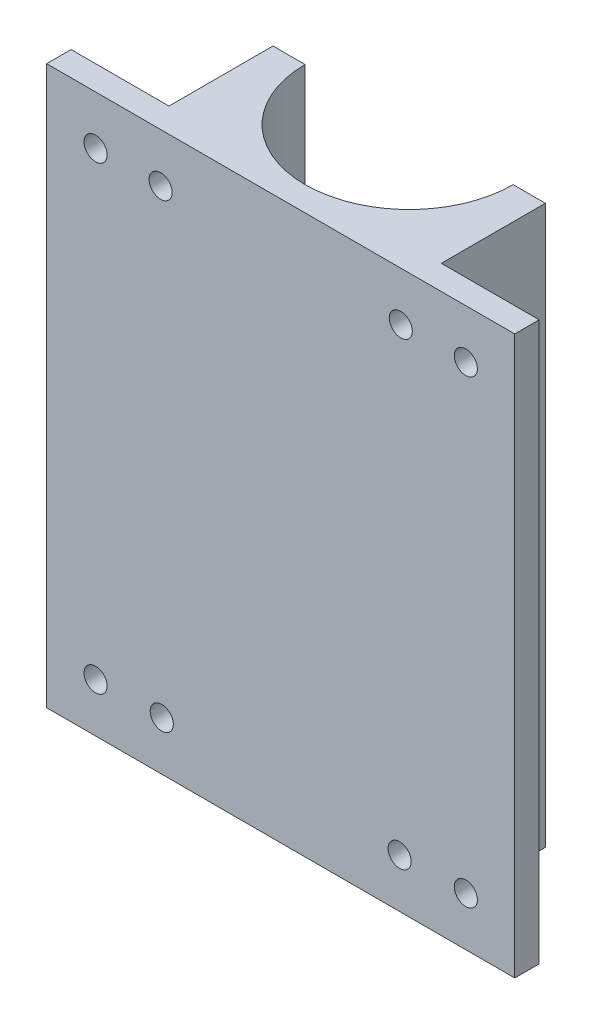
ISO-10303-21;
HEADER;
FILE_DESCRIPTION(('STEP AP214'),'2;1');
FILE_NAME('part.step','',(''),(''),'','','');
FILE_SCHEMA(('AUTOMOTIVE_DESIGN { 1 0 10303 214 1 1 1 1 }'));
ENDSEC;
DATA;
#1=APPLICATION_CONTEXT('core data for automotive mechanical design processes');
#2=APPLICATION_PROTOCOL_DEFINITION('international standard','automotive_design',2000,#1);
#3=PRODUCT_CONTEXT('',#1,'mechanical');
#4=PRODUCT('Part','Part','',(#3));
#5=PRODUCT_RELATED_PRODUCT_CATEGORY('part','',(#4));
#6=PRODUCT_DEFINITION_FORMATION('','',#4);
#7=PRODUCT_DEFINITION_CONTEXT('part definition',#1,'design');
#8=PRODUCT_DEFINITION('design','',#6,#7);
#9=PRODUCT_DEFINITION_SHAPE('','',#8);
#10=(LENGTH_UNIT() NAMED_UNIT(*) SI_UNIT(.MILLI.,.METRE.));
#11=(NAMED_UNIT(*) PLANE_ANGLE_UNIT() SI_UNIT($,.RADIAN.));
#12=(NAMED_UNIT(*) SI_UNIT($,.STERADIAN.) SOLID_ANGLE_UNIT());
#13=UNCERTAINTY_MEASURE_WITH_UNIT(LENGTH_MEASURE(1.E-05),#10,'distance_accuracy_value','');
#14=(GEOMETRIC_REPRESENTATION_CONTEXT(3) GLOBAL_UNCERTAINTY_ASSIGNED_CONTEXT((#13)) GLOBAL_UNIT_ASSIGNED_CONTEXT((#10,
#11,#12)) REPRESENTATION_CONTEXT('',''));
#15=CARTESIAN_POINT('',(0.,0.,0.));
#16=DIRECTION('',(0.,0.,1.));
#17=DIRECTION('',(1.,0.,0.));
#18=AXIS2_PLACEMENT_3D('',#15,#16,#17);
#19=CARTESIAN_POINT('',(6.525,72.39,-31.19817027));
#20=DIRECTION('',(0.,-1.,0.));
#21=DIRECTION('',(0.,0.,-1.));
#22=AXIS2_PLACEMENT_3D('',#19,#20,#21);
#23=CYLINDRICAL_SURFACE('',#22,13.5);
#24=CARTESIAN_POINT('',(6.525,51.39,-31.19817027));
#25=DIRECTION('',(0.,1.,0.));
#26=DIRECTION('',(0.,0.,1.));
#27=AXIS2_PLACEMENT_3D('',#24,#25,#26);
#28=CIRCLE('',#27,13.5);
#29=CARTESIAN_POINT('',(-6.975,51.39,-31.1981702709716));
#30=VERTEX_POINT('',#29);
#31=CARTESIAN_POINT('',(20.025,51.39,-31.1981702709716));
#32=VERTEX_POINT('',#31);
#33=EDGE_CURVE('E286',#30,#32,#28,.T.);
#34=ORIENTED_EDGE('',*,*,#33,.F.);
#35=DIRECTION('',(0.,-1.,0.));
#36=VECTOR('',#35,1.);
#37=CARTESIAN_POINT('',(-6.975,72.39,-31.1981702709716));
#38=LINE('',#37,#36);
#39=CARTESIAN_POINT('',(-6.975,72.39,-31.1981702709716));
#40=VERTEX_POINT('',#39);
#41=EDGE_CURVE('E11',#40,#30,#38,.T.);
#42=ORIENTED_EDGE('',*,*,#41,.F.);
#43=CARTESIAN_POINT('',(6.525,72.39,-31.19817027));
#44=DIRECTION('',(0.,1.,0.));
#45=DIRECTION('',(0.,0.,1.));
#46=AXIS2_PLACEMENT_3D('',#43,#44,#45);
#47=CIRCLE('',#46,13.5);
#48=CARTESIAN_POINT('',(20.025,72.39,-31.1981702709716));
#49=VERTEX_POINT('',#48);
#50=EDGE_CURVE('E173',#40,#49,#47,.T.);
#51=ORIENTED_EDGE('',*,*,#50,.T.);
#52=DIRECTION('',(0.,-1.,0.));
#53=VECTOR('',#52,1.);
#54=CARTESIAN_POINT('',(20.025,72.39,-31.1981702709716));
#55=LINE('',#54,#53);
#56=EDGE_CURVE('E138',#49,#32,#55,.T.);
#57=ORIENTED_EDGE('',*,*,#56,.T.);
#58=EDGE_LOOP('',(#34,#42,#51,#57));
#59=FACE_BOUND('',#58,.T.);
#60=ADVANCED_FACE('F33',(#59),#23,.F.);
#61=CARTESIAN_POINT('',(0.,72.39,-31.1981702709716));
#62=DIRECTION('',(0.,0.,1.));
#63=DIRECTION('',(1.,0.,0.));
#64=AXIS2_PLACEMENT_3D('',#61,#62,#63);
#65=PLANE('',#64);
#66=CARTESIAN_POINT('',(-9.0566884,66.04,-31.1981702709716));
#67=DIRECTION('',(0.,0.,-1.));
#68=DIRECTION('',(-1.,0.,0.));
#69=AXIS2_PLACEMENT_3D('',#66,#67,#68);
#70=CIRCLE('',#69,1.49999999999999);
#71=CARTESIAN_POINT('',(-10.5566884,66.04,-31.1981702709716));
#72=VERTEX_POINT('',#71);
#73=EDGE_CURVE('E233',#72,#72,#70,.T.);
#74=ORIENTED_EDGE('',*,*,#73,.F.);
#75=EDGE_LOOP('',(#74));
#76=FACE_BOUND('',#75,.T.);
#77=CARTESIAN_POINT('',(-8.9066884,6.35,-31.1981702709716));
#78=DIRECTION('',(0.,0.,-1.));
#79=DIRECTION('',(-1.,0.,0.));
#80=AXIS2_PLACEMENT_3D('',#77,#78,#79);
#81=CIRCLE('',#80,1.49999999999999);
#82=CARTESIAN_POINT('',(-10.4066884,6.35,-31.1981702709716));
#83=VERTEX_POINT('',#82);
#84=EDGE_CURVE('E237',#83,#83,#81,.T.);
#85=ORIENTED_EDGE('',*,*,#84,.F.);
#86=EDGE_LOOP('',(#85));
#87=FACE_BOUND('',#86,.T.);
#88=DIRECTION('',(-1.,0.,0.));
#89=VECTOR('',#88,1.);
#90=CARTESIAN_POINT('',(0.,0.,-31.1981702709716));
#91=LINE('',#90,#89);
#92=CARTESIAN_POINT('',(-6.675,0.,-31.1981702709716));
#93=VERTEX_POINT('',#92);
#94=CARTESIAN_POINT('',(-11.1466884,0.,-31.1981702709716));
#95=VERTEX_POINT('',#94);
#96=EDGE_CURVE('E145',#93,#95,#91,.T.);
#97=ORIENTED_EDGE('',*,*,#96,.T.);
#98=DIRECTION('',(0.,-1.,0.));
#99=VECTOR('',#98,1.);
#100=CARTESIAN_POINT('',(-11.1466884,72.39,-31.1981702709716));
#101=LINE('',#100,#99);
#102=CARTESIAN_POINT('',(-11.1466884,72.39,-31.1981702709716));
#103=VERTEX_POINT('',#102);
#104=EDGE_CURVE('E44',#103,#95,#101,.T.);
#105=ORIENTED_EDGE('',*,*,#104,.F.);
#106=DIRECTION('',(-1.,0.,0.));
#107=VECTOR('',#106,1.);
#108=CARTESIAN_POINT('',(0.,72.39,-31.1981702709716));
#109=LINE('',#108,#107);
#110=EDGE_CURVE('E265',#40,#103,#109,.T.);
#111=ORIENTED_EDGE('',*,*,#110,.F.);
#112=ORIENTED_EDGE('',*,*,#41,.T.);
#113=DIRECTION('',(1.,0.,0.));
#114=VECTOR('',#113,1.);
#115=CARTESIAN_POINT('',(-6.975,51.39,-31.1981702709716));
#116=LINE('',#115,#114);
#117=CARTESIAN_POINT('',(-6.675,51.39,-31.1981702709716));
#118=VERTEX_POINT('',#117);
#119=EDGE_CURVE('E294',#30,#118,#116,.T.);
#120=ORIENTED_EDGE('',*,*,#119,.T.);
#121=DIRECTION('',(0.,-1.,0.));
#122=VECTOR('',#121,1.);
#123=CARTESIAN_POINT('',(-6.675,51.39,-31.1981702709716));
#124=LINE('',#123,#122);
#125=EDGE_CURVE('E245',#118,#93,#124,.T.);
#126=ORIENTED_EDGE('',*,*,#125,.T.);
#127=EDGE_LOOP('',(#97,#105,#111,#112,#120,#126));
#128=FACE_BOUND('',#127,.T.);
#129=ADVANCED_FACE('F223',(#76,#87,#128),#65,.F.);
#130=CARTESIAN_POINT('',(-11.1466884,72.39,0.));
#131=DIRECTION('',(1.,0.,0.));
#132=DIRECTION('',(0.,0.,-1.));
#133=AXIS2_PLACEMENT_3D('',#130,#131,#132);
#134=PLANE('',#133);
#135=DIRECTION('',(0.,0.,1.));
#136=VECTOR('',#135,1.);
#137=CARTESIAN_POINT('',(-11.1466884,0.,0.));
#138=LINE('',#137,#136);
#139=CARTESIAN_POINT('',(-11.1466884,0.,-17.6981702709716));
#140=VERTEX_POINT('',#139);
#141=EDGE_CURVE('E147',#95,#140,#138,.T.);
#142=ORIENTED_EDGE('',*,*,#141,.T.);
#143=DIRECTION('',(0.,-1.,0.));
#144=VECTOR('',#143,1.);
#145=CARTESIAN_POINT('',(-11.1466884,72.39,-17.6981702709716));
#146=LINE('',#145,#144);
#147=CARTESIAN_POINT('',(-11.1466884,72.39,-17.6981702709716));
#148=VERTEX_POINT('',#147);
#149=EDGE_CURVE('E185',#148,#140,#146,.T.);
#150=ORIENTED_EDGE('',*,*,#149,.F.);
#151=DIRECTION('',(0.,0.,1.));
#152=VECTOR('',#151,1.);
#153=CARTESIAN_POINT('',(-11.1466884,72.39,0.));
#154=LINE('',#153,#152);
#155=EDGE_CURVE('E251',#103,#148,#154,.T.);
#156=ORIENTED_EDGE('',*,*,#155,.F.);
#157=ORIENTED_EDGE('',*,*,#104,.T.);
#158=EDGE_LOOP('',(#142,#150,#156,#157));
#159=FACE_BOUND('',#158,.T.);
#160=ADVANCED_FACE('F220',(#159),#134,.F.);
#161=CARTESIAN_POINT('',(0.,72.39,-17.6981702709716));
#162=DIRECTION('',(0.,0.,-1.));
#163=DIRECTION('',(-1.,0.,0.));
#164=AXIS2_PLACEMENT_3D('',#161,#162,#163);
#165=PLANE('',#164);
#166=CARTESIAN_POINT('',(-17.4985284,6.35,-17.6981702709716));
#167=DIRECTION('',(0.,0.,-1.));
#168=DIRECTION('',(-1.,0.,0.));
#169=AXIS2_PLACEMENT_3D('',#166,#167,#168);
#170=CIRCLE('',#169,1.49999999999999);
#171=CARTESIAN_POINT('',(-18.9985284,6.35,-17.6981702709716));
#172=VERTEX_POINT('',#171);
#173=EDGE_CURVE('E330',#172,#172,#170,.T.);
#174=ORIENTED_EDGE('',*,*,#173,.F.);
#175=EDGE_LOOP('',(#174));
#176=FACE_BOUND('',#175,.T.);
#177=CARTESIAN_POINT('',(-17.4985284,66.04,-17.6981702709716));
#178=DIRECTION('',(0.,0.,-1.));
#179=DIRECTION('',(-1.,0.,0.));
#180=AXIS2_PLACEMENT_3D('',#177,#178,#179);
#181=CIRCLE('',#180,1.49999999999999);
#182=CARTESIAN_POINT('',(-18.9985284,66.04,-17.6981702709716));
#183=VERTEX_POINT('',#182);
#184=EDGE_CURVE('E324',#183,#183,#181,.T.);
#185=ORIENTED_EDGE('',*,*,#184,.F.);
#186=EDGE_LOOP('',(#185));
#187=FACE_BOUND('',#186,.T.);
#188=DIRECTION('',(1.,0.,0.));
#189=VECTOR('',#188,1.);
#190=CARTESIAN_POINT('',(0.,0.,-17.6981702709716));
#191=LINE('',#190,#189);
#192=CARTESIAN_POINT('',(-23.8485284,0.,-17.6981702709716));
#193=VERTEX_POINT('',#192);
#194=EDGE_CURVE('E151',#193,#140,#191,.T.);
#195=ORIENTED_EDGE('',*,*,#194,.F.);
#196=DIRECTION('',(0.,-1.,0.));
#197=VECTOR('',#196,1.);
#198=CARTESIAN_POINT('',(-23.8485284,72.39,-17.6981702709716));
#199=LINE('',#198,#197);
#200=CARTESIAN_POINT('',(-23.8485284,72.39,-17.6981702709716));
#201=VERTEX_POINT('',#200);
#202=EDGE_CURVE('E183',#201,#193,#199,.T.);
#203=ORIENTED_EDGE('',*,*,#202,.F.);
#204=DIRECTION('',(1.,0.,0.));
#205=VECTOR('',#204,1.);
#206=CARTESIAN_POINT('',(0.,72.39,-17.6981702709716));
#207=LINE('',#206,#205);
#208=EDGE_CURVE('E260',#201,#148,#207,.T.);
#209=ORIENTED_EDGE('',*,*,#208,.T.);
#210=ORIENTED_EDGE('',*,*,#149,.T.);
#211=EDGE_LOOP('',(#195,#203,#209,#210));
#212=FACE_BOUND('',#211,.T.);
#213=ADVANCED_FACE('F216',(#176,#187,#212),#165,.T.);
#214=CARTESIAN_POINT('',(-23.8485284,72.39,0.));
#215=DIRECTION('',(1.,0.,0.));
#216=DIRECTION('',(0.,0.,-1.));
#217=AXIS2_PLACEMENT_3D('',#214,#215,#216);
#218=PLANE('',#217);
#219=DIRECTION('',(0.,0.,1.));
#220=VECTOR('',#219,1.);
#221=CARTESIAN_POINT('',(-23.8485284,0.,0.));
#222=LINE('',#221,#220);
#223=CARTESIAN_POINT('',(-23.8485284,0.,-14.5231702709716));
#224=VERTEX_POINT('',#223);
#225=EDGE_CURVE('E154',#193,#224,#222,.T.);
#226=ORIENTED_EDGE('',*,*,#225,.T.);
#227=DIRECTION('',(0.,-1.,0.));
#228=VECTOR('',#227,1.);
#229=CARTESIAN_POINT('',(-23.8485284,72.39,-14.5231702709716));
#230=LINE('',#229,#228);
#231=CARTESIAN_POINT('',(-23.8485284,72.39,-14.5231702709716));
#232=VERTEX_POINT('',#231);
#233=EDGE_CURVE('E180',#232,#224,#230,.T.);
#234=ORIENTED_EDGE('',*,*,#233,.F.);
#235=DIRECTION('',(0.,0.,1.));
#236=VECTOR('',#235,1.);
#237=CARTESIAN_POINT('',(-23.8485284,72.39,0.));
#238=LINE('',#237,#236);
#239=EDGE_CURVE('E261',#201,#232,#238,.T.);
#240=ORIENTED_EDGE('',*,*,#239,.F.);
#241=ORIENTED_EDGE('',*,*,#202,.T.);
#242=EDGE_LOOP('',(#226,#234,#240,#241));
#243=FACE_BOUND('',#242,.T.);
#244=ADVANCED_FACE('F212',(#243),#218,.F.);
#245=CARTESIAN_POINT('',(0.,72.39,-14.5231702709716));
#246=DIRECTION('',(0.,0.,-1.));
#247=DIRECTION('',(-1.,0.,0.));
#248=AXIS2_PLACEMENT_3D('',#245,#246,#247);
#249=PLANE('',#248);
#250=CARTESIAN_POINT('',(22.1133116,66.04,-14.5231702709716));
#251=DIRECTION('',(0.,0.,-1.));
#252=DIRECTION('',(-1.,0.,0.));
#253=AXIS2_PLACEMENT_3D('',#250,#251,#252);
#254=CIRCLE('',#253,1.5);
#255=CARTESIAN_POINT('',(20.6133116,66.04,-14.5231702709716));
#256=VERTEX_POINT('',#255);
#257=EDGE_CURVE('E347',#256,#256,#254,.T.);
#258=ORIENTED_EDGE('',*,*,#257,.T.);
#259=EDGE_LOOP('',(#258));
#260=FACE_BOUND('',#259,.T.);
#261=CARTESIAN_POINT('',(-9.0566884,66.04,-14.5231702709716));
#262=DIRECTION('',(0.,0.,-1.));
#263=DIRECTION('',(-1.,0.,0.));
#264=AXIS2_PLACEMENT_3D('',#261,#262,#263);
#265=CIRCLE('',#264,1.5);
#266=CARTESIAN_POINT('',(-10.5566884,66.04,-14.5231702709716));
#267=VERTEX_POINT('',#266);
#268=EDGE_CURVE('E343',#267,#267,#265,.T.);
#269=ORIENTED_EDGE('',*,*,#268,.T.);
#270=EDGE_LOOP('',(#269));
#271=FACE_BOUND('',#270,.T.);
#272=CARTESIAN_POINT('',(-8.9066884,6.35,-14.5231702709716));
#273=DIRECTION('',(0.,0.,-1.));
#274=DIRECTION('',(-1.,0.,0.));
#275=AXIS2_PLACEMENT_3D('',#272,#273,#274);
#276=CIRCLE('',#275,1.5);
#277=CARTESIAN_POINT('',(-10.4066884,6.35,-14.5231702709716));
#278=VERTEX_POINT('',#277);
#279=EDGE_CURVE('E339',#278,#278,#276,.T.);
#280=ORIENTED_EDGE('',*,*,#279,.T.);
#281=EDGE_LOOP('',(#280));
#282=FACE_BOUND('',#281,.T.);
#283=CARTESIAN_POINT('',(21.9633116,6.35,-14.5231702709716));
#284=DIRECTION('',(0.,0.,-1.));
#285=DIRECTION('',(-1.,0.,0.));
#286=AXIS2_PLACEMENT_3D('',#283,#284,#285);
#287=CIRCLE('',#286,1.5);
#288=CARTESIAN_POINT('',(20.4633116,6.35,-14.5231702709716));
#289=VERTEX_POINT('',#288);
#290=EDGE_CURVE('E333',#289,#289,#287,.T.);
#291=ORIENTED_EDGE('',*,*,#290,.T.);
#292=EDGE_LOOP('',(#291));
#293=FACE_BOUND('',#292,.T.);
#294=CARTESIAN_POINT('',(-17.4985284,6.35,-14.5231702709716));
#295=DIRECTION('',(0.,0.,-1.));
#296=DIRECTION('',(-1.,0.,0.));
#297=AXIS2_PLACEMENT_3D('',#294,#295,#296);
#298=CIRCLE('',#297,1.5);
#299=CARTESIAN_POINT('',(-18.9985284,6.35,-14.5231702709716));
#300=VERTEX_POINT('',#299);
#301=EDGE_CURVE('E327',#300,#300,#298,.T.);
#302=ORIENTED_EDGE('',*,*,#301,.T.);
#303=EDGE_LOOP('',(#302));
#304=FACE_BOUND('',#303,.T.);
#305=CARTESIAN_POINT('',(-17.4985284,66.04,-14.5231702709716));
#306=DIRECTION('',(0.,0.,-1.));
#307=DIRECTION('',(-1.,0.,0.));
#308=AXIS2_PLACEMENT_3D('',#305,#306,#307);
#309=CIRCLE('',#308,1.5);
#310=CARTESIAN_POINT('',(-18.9985284,66.04,-14.5231702709716));
#311=VERTEX_POINT('',#310);
#312=EDGE_CURVE('E321',#311,#311,#309,.T.);
#313=ORIENTED_EDGE('',*,*,#312,.T.);
#314=EDGE_LOOP('',(#313));
#315=FACE_BOUND('',#314,.T.);
#316=CARTESIAN_POINT('',(30.5533116,66.04,-14.5231702709716));
#317=DIRECTION('',(0.,0.,-1.));
#318=DIRECTION('',(-1.,0.,0.));
#319=AXIS2_PLACEMENT_3D('',#316,#317,#318);
#320=CIRCLE('',#319,1.5);
#321=CARTESIAN_POINT('',(29.0533116,66.04,-14.5231702709716));
#322=VERTEX_POINT('',#321);
#323=EDGE_CURVE('E315',#322,#322,#320,.T.);
#324=ORIENTED_EDGE('',*,*,#323,.T.);
#325=EDGE_LOOP('',(#324));
#326=FACE_BOUND('',#325,.T.);
#327=CARTESIAN_POINT('',(30.5533116,6.35,-14.5231702709716));
#328=DIRECTION('',(0.,0.,-1.));
#329=DIRECTION('',(-1.,0.,0.));
#330=AXIS2_PLACEMENT_3D('',#327,#328,#329);
#331=CIRCLE('',#330,1.5);
#332=CARTESIAN_POINT('',(29.0533116,6.35,-14.5231702709716));
#333=VERTEX_POINT('',#332);
#334=EDGE_CURVE('E309',#333,#333,#331,.T.);
#335=ORIENTED_EDGE('',*,*,#334,.T.);
#336=EDGE_LOOP('',(#335));
#337=FACE_BOUND('',#336,.T.);
#338=DIRECTION('',(1.,0.,0.));
#339=VECTOR('',#338,1.);
#340=CARTESIAN_POINT('',(0.,0.,-14.5231702709716));
#341=LINE('',#340,#339);
#342=CARTESIAN_POINT('',(36.9033116,0.,-14.5231702709716));
#343=VERTEX_POINT('',#342);
#344=EDGE_CURVE('E156',#224,#343,#341,.T.);
#345=ORIENTED_EDGE('',*,*,#344,.T.);
#346=DIRECTION('',(0.,-1.,0.));
#347=VECTOR('',#346,1.);
#348=CARTESIAN_POINT('',(36.9033116,72.39,-14.5231702709716));
#349=LINE('',#348,#347);
#350=CARTESIAN_POINT('',(36.9033116,72.39,-14.5231702709716));
#351=VERTEX_POINT('',#350);
#352=EDGE_CURVE('E178',#351,#343,#349,.T.);
#353=ORIENTED_EDGE('',*,*,#352,.F.);
#354=DIRECTION('',(1.,0.,0.));
#355=VECTOR('',#354,1.);
#356=CARTESIAN_POINT('',(0.,72.39,-14.5231702709716));
#357=LINE('',#356,#355);
#358=EDGE_CURVE('E263',#232,#351,#357,.T.);
#359=ORIENTED_EDGE('',*,*,#358,.F.);
#360=ORIENTED_EDGE('',*,*,#233,.T.);
#361=EDGE_LOOP('',(#345,#353,#359,#360));
#362=FACE_BOUND('',#361,.T.);
#363=ADVANCED_FACE('F208',(#260,#271,#282,#293,#304,#315,#326,#337,#362),#249,.F.);
#364=CARTESIAN_POINT('',(36.9033116,72.39,0.));
#365=DIRECTION('',(1.,0.,0.));
#366=DIRECTION('',(0.,0.,-1.));
#367=AXIS2_PLACEMENT_3D('',#364,#365,#366);
#368=PLANE('',#367);
#369=DIRECTION('',(0.,0.,1.));
#370=VECTOR('',#369,1.);
#371=CARTESIAN_POINT('',(36.9033116,0.,0.));
#372=LINE('',#371,#370);
#373=CARTESIAN_POINT('',(36.9033116,0.,-17.6981702709716));
#374=VERTEX_POINT('',#373);
#375=EDGE_CURVE('E159',#374,#343,#372,.T.);
#376=ORIENTED_EDGE('',*,*,#375,.F.);
#377=DIRECTION('',(0.,-1.,0.));
#378=VECTOR('',#377,1.);
#379=CARTESIAN_POINT('',(36.9033116,72.39,-17.6981702709716));
#380=LINE('',#379,#378);
#381=CARTESIAN_POINT('',(36.9033116,72.39,-17.6981702709716));
#382=VERTEX_POINT('',#381);
#383=EDGE_CURVE('E128',#382,#374,#380,.T.);
#384=ORIENTED_EDGE('',*,*,#383,.F.);
#385=DIRECTION('',(0.,0.,1.));
#386=VECTOR('',#385,1.);
#387=CARTESIAN_POINT('',(36.9033116,72.39,0.));
#388=LINE('',#387,#386);
#389=EDGE_CURVE('E134',#382,#351,#388,.T.);
#390=ORIENTED_EDGE('',*,*,#389,.T.);
#391=ORIENTED_EDGE('',*,*,#352,.T.);
#392=EDGE_LOOP('',(#376,#384,#390,#391));
#393=FACE_BOUND('',#392,.T.);
#394=ADVANCED_FACE('F204',(#393),#368,.T.);
#395=CARTESIAN_POINT('',(0.,72.39,-17.6981702709716));
#396=DIRECTION('',(0.,0.,-1.));
#397=DIRECTION('',(-1.,0.,0.));
#398=AXIS2_PLACEMENT_3D('',#395,#396,#397);
#399=PLANE('',#398);
#400=CARTESIAN_POINT('',(30.5533116,66.04,-17.6981702709716));
#401=DIRECTION('',(0.,0.,-1.));
#402=DIRECTION('',(-1.,0.,0.));
#403=AXIS2_PLACEMENT_3D('',#400,#401,#402);
#404=CIRCLE('',#403,1.5);
#405=CARTESIAN_POINT('',(29.0533116,66.04,-17.6981702709716));
#406=VERTEX_POINT('',#405);
#407=EDGE_CURVE('E318',#406,#406,#404,.T.);
#408=ORIENTED_EDGE('',*,*,#407,.F.);
#409=EDGE_LOOP('',(#408));
#410=FACE_BOUND('',#409,.T.);
#411=CARTESIAN_POINT('',(30.5533116,6.35,-17.6981702709716));
#412=DIRECTION('',(0.,0.,-1.));
#413=DIRECTION('',(-1.,0.,0.));
#414=AXIS2_PLACEMENT_3D('',#411,#412,#413);
#415=CIRCLE('',#414,1.5);
#416=CARTESIAN_POINT('',(29.0533116,6.35,-17.6981702709716));
#417=VERTEX_POINT('',#416);
#418=EDGE_CURVE('E312',#417,#417,#415,.T.);
#419=ORIENTED_EDGE('',*,*,#418,.F.);
#420=EDGE_LOOP('',(#419));
#421=FACE_BOUND('',#420,.T.);
#422=DIRECTION('',(1.,0.,0.));
#423=VECTOR('',#422,1.);
#424=CARTESIAN_POINT('',(0.,0.,-17.6981702709716));
#425=LINE('',#424,#423);
#426=CARTESIAN_POINT('',(24.2033116,0.,-17.6981702709716));
#427=VERTEX_POINT('',#426);
#428=EDGE_CURVE('E126',#427,#374,#425,.T.);
#429=ORIENTED_EDGE('',*,*,#428,.F.);
#430=CARTESIAN_POINT('',(24.2033116,72.39,-17.6981702709716));
#431=DIRECTION('',(0.,-1.,0.));
#432=VECTOR('',#431,1.);
#433=LINE('',#430,#432);
#434=CARTESIAN_POINT('',(24.2033116,72.39,-17.6981702709716));
#435=VERTEX_POINT('',#434);
#436=EDGE_CURVE('E84',#435,#427,#433,.T.);
#437=ORIENTED_EDGE('',*,*,#436,.F.);
#438=DIRECTION('',(1.,0.,0.));
#439=VECTOR('',#438,1.);
#440=CARTESIAN_POINT('',(0.,72.39,-17.6981702709716));
#441=LINE('',#440,#439);
#442=EDGE_CURVE('E124',#435,#382,#441,.T.);
#443=ORIENTED_EDGE('',*,*,#442,.T.);
#444=ORIENTED_EDGE('',*,*,#383,.T.);
#445=EDGE_LOOP('',(#429,#437,#443,#444));
#446=FACE_BOUND('',#445,.T.);
#447=ADVANCED_FACE('F123',(#410,#421,#446),#399,.T.);
#448=CARTESIAN_POINT('',(24.2033116,72.39,0.));
#449=DIRECTION('',(1.,0.,0.));
#450=DIRECTION('',(0.,0.,-1.));
#451=AXIS2_PLACEMENT_3D('',#448,#449,#450);
#452=PLANE('',#451);
#453=DIRECTION('',(0.,0.,1.));
#454=VECTOR('',#453,1.);
#455=CARTESIAN_POINT('',(24.2033116,0.,0.));
#456=LINE('',#455,#454);
#457=CARTESIAN_POINT('',(24.2033116,0.,-31.1981702709716));
#458=VERTEX_POINT('',#457);
#459=EDGE_CURVE('E165',#458,#427,#456,.T.);
#460=ORIENTED_EDGE('',*,*,#459,.F.);
#461=DIRECTION('',(0.,-1.,0.));
#462=VECTOR('',#461,1.);
#463=CARTESIAN_POINT('',(24.2033116,72.39,-31.1981702709716));
#464=LINE('',#463,#462);
#465=CARTESIAN_POINT('',(24.2033116,72.39,-31.1981702709716));
#466=VERTEX_POINT('',#465);
#467=EDGE_CURVE('E91',#466,#458,#464,.T.);
#468=ORIENTED_EDGE('',*,*,#467,.F.);
#469=DIRECTION('',(0.,0.,1.));
#470=VECTOR('',#469,1.);
#471=CARTESIAN_POINT('',(24.2033116,72.39,0.));
#472=LINE('',#471,#470);
#473=EDGE_CURVE('E132',#466,#435,#472,.T.);
#474=ORIENTED_EDGE('',*,*,#473,.T.);
#475=ORIENTED_EDGE('',*,*,#436,.T.);
#476=EDGE_LOOP('',(#460,#468,#474,#475));
#477=FACE_BOUND('',#476,.T.);
#478=ADVANCED_FACE('F136',(#477),#452,.T.);
#479=CARTESIAN_POINT('',(0.,72.39,-31.1981702709716));
#480=DIRECTION('',(0.,0.,1.));
#481=DIRECTION('',(1.,0.,0.));
#482=AXIS2_PLACEMENT_3D('',#479,#480,#481);
#483=PLANE('',#482);
#484=CARTESIAN_POINT('',(22.1133116,66.04,-31.1981702709716));
#485=DIRECTION('',(0.,0.,-1.));
#486=DIRECTION('',(-1.,0.,0.));
#487=AXIS2_PLACEMENT_3D('',#484,#485,#486);
#488=CIRCLE('',#487,1.49999999999999);
#489=CARTESIAN_POINT('',(20.6133116,66.04,-31.1981702709716));
#490=VERTEX_POINT('',#489);
#491=EDGE_CURVE('E350',#490,#490,#488,.T.);
#492=ORIENTED_EDGE('',*,*,#491,.F.);
#493=EDGE_LOOP('',(#492));
#494=FACE_BOUND('',#493,.T.);
#495=CARTESIAN_POINT('',(21.9633116,6.35,-31.1981702709716));
#496=DIRECTION('',(0.,0.,-1.));
#497=DIRECTION('',(-1.,0.,0.));
#498=AXIS2_PLACEMENT_3D('',#495,#496,#497);
#499=CIRCLE('',#498,1.49999999999999);
#500=CARTESIAN_POINT('',(20.4633116,6.35,-31.1981702709716));
#501=VERTEX_POINT('',#500);
#502=EDGE_CURVE('E336',#501,#501,#499,.T.);
#503=ORIENTED_EDGE('',*,*,#502,.F.);
#504=EDGE_LOOP('',(#503));
#505=FACE_BOUND('',#504,.T.);
#506=DIRECTION('',(-1.,0.,0.));
#507=VECTOR('',#506,1.);
#508=CARTESIAN_POINT('',(0.,0.,-31.1981702709716));
#509=LINE('',#508,#507);
#510=CARTESIAN_POINT('',(19.725,0.,-31.1981702709716));
#511=VERTEX_POINT('',#510);
#512=EDGE_CURVE('E169',#458,#511,#509,.T.);
#513=ORIENTED_EDGE('',*,*,#512,.T.);
#514=DIRECTION('',(0.,-1.,0.));
#515=VECTOR('',#514,1.);
#516=CARTESIAN_POINT('',(19.725,51.39,-31.1981702709716));
#517=LINE('',#516,#515);
#518=CARTESIAN_POINT('',(19.725,51.39,-31.1981702709716));
#519=VERTEX_POINT('',#518);
#520=EDGE_CURVE('E148',#519,#511,#517,.T.);
#521=ORIENTED_EDGE('',*,*,#520,.F.);
#522=DIRECTION('',(-1.,0.,0.));
#523=VECTOR('',#522,1.);
#524=CARTESIAN_POINT('',(20.025,51.39,-31.1981702709716));
#525=LINE('',#524,#523);
#526=EDGE_CURVE('E304',#32,#519,#525,.T.);
#527=ORIENTED_EDGE('',*,*,#526,.F.);
#528=ORIENTED_EDGE('',*,*,#56,.F.);
#529=DIRECTION('',(-1.,0.,0.));
#530=VECTOR('',#529,1.);
#531=CARTESIAN_POINT('',(0.,72.39,-31.1981702709716));
#532=LINE('',#531,#530);
#533=EDGE_CURVE('E53',#466,#49,#532,.T.);
#534=ORIENTED_EDGE('',*,*,#533,.F.);
#535=ORIENTED_EDGE('',*,*,#467,.T.);
#536=EDGE_LOOP('',(#513,#521,#527,#528,#534,#535));
#537=FACE_BOUND('',#536,.T.);
#538=ADVANCED_FACE('F199',(#494,#505,#537),#483,.F.);
#539=CARTESIAN_POINT('',(0.,72.39,0.));
#540=DIRECTION('',(0.,1.,0.));
#541=DIRECTION('',(0.,0.,1.));
#542=AXIS2_PLACEMENT_3D('',#539,#540,#541);
#543=PLANE('',#542);
#544=ORIENTED_EDGE('',*,*,#50,.F.);
#545=ORIENTED_EDGE('',*,*,#110,.T.);
#546=ORIENTED_EDGE('',*,*,#155,.T.);
#547=ORIENTED_EDGE('',*,*,#208,.F.);
#548=ORIENTED_EDGE('',*,*,#239,.T.);
#549=ORIENTED_EDGE('',*,*,#358,.T.);
#550=ORIENTED_EDGE('',*,*,#389,.F.);
#551=ORIENTED_EDGE('',*,*,#442,.F.);
#552=ORIENTED_EDGE('',*,*,#473,.F.);
#553=ORIENTED_EDGE('',*,*,#533,.T.);
#554=EDGE_LOOP('',(#544,#545,#546,#547,#548,#549,#550,#551,#552,#553));
#555=FACE_BOUND('',#554,.T.);
#556=ADVANCED_FACE('F131',(#555),#543,.T.);
#557=CARTESIAN_POINT('',(0.,0.,0.));
#558=DIRECTION('',(0.,1.,0.));
#559=DIRECTION('',(0.,0.,1.));
#560=AXIS2_PLACEMENT_3D('',#557,#558,#559);
#561=PLANE('',#560);
#562=ORIENTED_EDGE('',*,*,#96,.F.);
#563=CARTESIAN_POINT('',(6.525,0.,-31.19817027));
#564=DIRECTION('',(0.,1.,0.));
#565=DIRECTION('',(0.,0.,1.));
#566=AXIS2_PLACEMENT_3D('',#563,#564,#565);
#567=CIRCLE('',#566,13.2);
#568=EDGE_CURVE('E274',#93,#511,#567,.T.);
#569=ORIENTED_EDGE('',*,*,#568,.T.);
#570=ORIENTED_EDGE('',*,*,#512,.F.);
#571=ORIENTED_EDGE('',*,*,#459,.T.);
#572=ORIENTED_EDGE('',*,*,#428,.T.);
#573=ORIENTED_EDGE('',*,*,#375,.T.);
#574=ORIENTED_EDGE('',*,*,#344,.F.);
#575=ORIENTED_EDGE('',*,*,#225,.F.);
#576=ORIENTED_EDGE('',*,*,#194,.T.);
#577=ORIENTED_EDGE('',*,*,#141,.F.);
#578=EDGE_LOOP('',(#562,#569,#570,#571,#572,#573,#574,#575,#576,#577));
#579=FACE_BOUND('',#578,.T.);
#580=ADVANCED_FACE('F252',(#579),#561,.F.);
#581=CARTESIAN_POINT('',(6.525,51.39,-31.19817027));
#582=DIRECTION('',(0.,-1.,0.));
#583=DIRECTION('',(0.,0.,-1.));
#584=AXIS2_PLACEMENT_3D('',#581,#582,#583);
#585=CYLINDRICAL_SURFACE('',#584,13.2);
#586=ORIENTED_EDGE('',*,*,#568,.F.);
#587=ORIENTED_EDGE('',*,*,#125,.F.);
#588=CARTESIAN_POINT('',(6.525,51.39,-31.19817027));
#589=DIRECTION('',(0.,1.,0.));
#590=DIRECTION('',(0.,0.,1.));
#591=AXIS2_PLACEMENT_3D('',#588,#589,#590);
#592=CIRCLE('',#591,13.2);
#593=EDGE_CURVE('E284',#118,#519,#592,.T.);
#594=ORIENTED_EDGE('',*,*,#593,.T.);
#595=ORIENTED_EDGE('',*,*,#520,.T.);
#596=EDGE_LOOP('',(#586,#587,#594,#595));
#597=FACE_BOUND('',#596,.T.);
#598=ADVANCED_FACE('F282',(#597),#585,.F.);
#599=CARTESIAN_POINT('',(6.525,51.39,-31.19817027));
#600=DIRECTION('',(0.,1.,0.));
#601=DIRECTION('',(0.,0.,1.));
#602=AXIS2_PLACEMENT_3D('',#599,#600,#601);
#603=PLANE('',#602);
#604=ORIENTED_EDGE('',*,*,#119,.F.);
#605=ORIENTED_EDGE('',*,*,#33,.T.);
#606=ORIENTED_EDGE('',*,*,#526,.T.);
#607=ORIENTED_EDGE('',*,*,#593,.F.);
#608=EDGE_LOOP('',(#604,#605,#606,#607));
#609=FACE_BOUND('',#608,.T.);
#610=ADVANCED_FACE('F303',(#609),#603,.T.);
#611=CARTESIAN_POINT('',(30.5533116,6.35,-17.6981702709716));
#612=DIRECTION('',(0.,0.,-1.));
#613=DIRECTION('',(-1.,0.,0.));
#614=AXIS2_PLACEMENT_3D('',#611,#612,#613);
#615=CYLINDRICAL_SURFACE('',#614,1.5);
#616=ORIENTED_EDGE('',*,*,#334,.F.);
#617=EDGE_LOOP('',(#616));
#618=FACE_BOUND('',#617,.T.);
#619=ORIENTED_EDGE('',*,*,#418,.T.);
#620=EDGE_LOOP('',(#619));
#621=FACE_BOUND('',#620,.T.);
#622=ADVANCED_FACE('F385',(#618,#621),#615,.F.);
#623=CARTESIAN_POINT('',(30.5533116,66.04,-17.6981702709716));
#624=DIRECTION('',(0.,0.,-1.));
#625=DIRECTION('',(-1.,0.,0.));
#626=AXIS2_PLACEMENT_3D('',#623,#624,#625);
#627=CYLINDRICAL_SURFACE('',#626,1.5);
#628=ORIENTED_EDGE('',*,*,#323,.F.);
#629=EDGE_LOOP('',(#628));
#630=FACE_BOUND('',#629,.T.);
#631=ORIENTED_EDGE('',*,*,#407,.T.);
#632=EDGE_LOOP('',(#631));
#633=FACE_BOUND('',#632,.T.);
#634=ADVANCED_FACE('F381',(#630,#633),#627,.F.);
#635=CARTESIAN_POINT('',(-17.4985284,66.04,-17.6981702709716));
#636=DIRECTION('',(0.,0.,-1.));
#637=DIRECTION('',(-1.,0.,0.));
#638=AXIS2_PLACEMENT_3D('',#635,#636,#637);
#639=CYLINDRICAL_SURFACE('',#638,1.49999999999999);
#640=ORIENTED_EDGE('',*,*,#312,.F.);
#641=EDGE_LOOP('',(#640));
#642=FACE_BOUND('',#641,.T.);
#643=ORIENTED_EDGE('',*,*,#184,.T.);
#644=EDGE_LOOP('',(#643));
#645=FACE_BOUND('',#644,.T.);
#646=ADVANCED_FACE('F373',(#642,#645),#639,.F.);
#647=CARTESIAN_POINT('',(-17.4985284,6.35,-17.6981702709716));
#648=DIRECTION('',(0.,0.,-1.));
#649=DIRECTION('',(-1.,0.,0.));
#650=AXIS2_PLACEMENT_3D('',#647,#648,#649);
#651=CYLINDRICAL_SURFACE('',#650,1.49999999999999);
#652=ORIENTED_EDGE('',*,*,#301,.F.);
#653=EDGE_LOOP('',(#652));
#654=FACE_BOUND('',#653,.T.);
#655=ORIENTED_EDGE('',*,*,#173,.T.);
#656=EDGE_LOOP('',(#655));
#657=FACE_BOUND('',#656,.T.);
#658=ADVANCED_FACE('F363',(#654,#657),#651,.F.);
#659=CARTESIAN_POINT('',(21.9633116,6.35,-31.1981702709716));
#660=DIRECTION('',(0.,0.,-1.));
#661=DIRECTION('',(-1.,0.,0.));
#662=AXIS2_PLACEMENT_3D('',#659,#660,#661);
#663=CYLINDRICAL_SURFACE('',#662,1.49999999999999);
#664=ORIENTED_EDGE('',*,*,#290,.F.);
#665=EDGE_LOOP('',(#664));
#666=FACE_BOUND('',#665,.T.);
#667=ORIENTED_EDGE('',*,*,#502,.T.);
#668=EDGE_LOOP('',(#667));
#669=FACE_BOUND('',#668,.T.);
#670=ADVANCED_FACE('F360',(#666,#669),#663,.F.);
#671=CARTESIAN_POINT('',(-8.9066884,6.35,-31.1981702709716));
#672=DIRECTION('',(0.,0.,-1.));
#673=DIRECTION('',(-1.,0.,0.));
#674=AXIS2_PLACEMENT_3D('',#671,#672,#673);
#675=CYLINDRICAL_SURFACE('',#674,1.49999999999999);
#676=ORIENTED_EDGE('',*,*,#279,.F.);
#677=EDGE_LOOP('',(#676));
#678=FACE_BOUND('',#677,.T.);
#679=ORIENTED_EDGE('',*,*,#84,.T.);
#680=EDGE_LOOP('',(#679));
#681=FACE_BOUND('',#680,.T.);
#682=ADVANCED_FACE('F362',(#678,#681),#675,.F.);
#683=CARTESIAN_POINT('',(-9.0566884,66.04,-31.1981702709716));
#684=DIRECTION('',(0.,0.,-1.));
#685=DIRECTION('',(-1.,0.,0.));
#686=AXIS2_PLACEMENT_3D('',#683,#684,#685);
#687=CYLINDRICAL_SURFACE('',#686,1.49999999999999);
#688=ORIENTED_EDGE('',*,*,#268,.F.);
#689=EDGE_LOOP('',(#688));
#690=FACE_BOUND('',#689,.T.);
#691=ORIENTED_EDGE('',*,*,#73,.T.);
#692=EDGE_LOOP('',(#691));
#693=FACE_BOUND('',#692,.T.);
#694=ADVANCED_FACE('F370',(#690,#693),#687,.F.);
#695=CARTESIAN_POINT('',(22.1133116,66.04,-31.1981702709716));
#696=DIRECTION('',(0.,0.,-1.));
#697=DIRECTION('',(-1.,0.,0.));
#698=AXIS2_PLACEMENT_3D('',#695,#696,#697);
#699=CYLINDRICAL_SURFACE('',#698,1.49999999999999);
#700=ORIENTED_EDGE('',*,*,#257,.F.);
#701=EDGE_LOOP('',(#700));
#702=FACE_BOUND('',#701,.T.);
#703=ORIENTED_EDGE('',*,*,#491,.T.);
#704=EDGE_LOOP('',(#703));
#705=FACE_BOUND('',#704,.T.);
#706=ADVANCED_FACE('F354',(#702,#705),#699,.F.);
#707=CLOSED_SHELL('',(#60,#129,#160,#213,#244,#363,#394,#447,#478,#538,#556,#580,#598,#610,#622,
#634,#646,#658,#670,#682,#694,#706));
#708=MANIFOLD_SOLID_BREP('B2',#707);
#709=ADVANCED_BREP_SHAPE_REPRESENTATION('',(#18,#708),#14);
#710=SHAPE_DEFINITION_REPRESENTATION(#9,#709);
ENDSEC;
END-ISO-10303-21;
